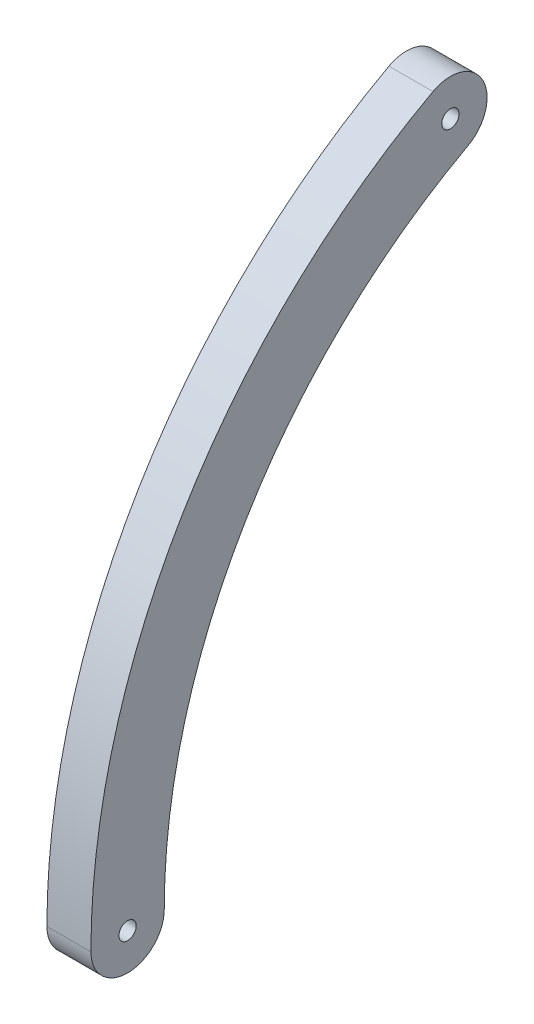
ISO-10303-21;
HEADER;
FILE_DESCRIPTION(('STEP AP214'),'2;1');
FILE_NAME('part.step','',(''),(''),'','','');
FILE_SCHEMA(('AUTOMOTIVE_DESIGN { 1 0 10303 214 1 1 1 1 }'));
ENDSEC;
DATA;
#1=APPLICATION_CONTEXT('core data for automotive mechanical design processes');
#2=APPLICATION_PROTOCOL_DEFINITION('international standard','automotive_design',2000,#1);
#3=PRODUCT_CONTEXT('',#1,'mechanical');
#4=PRODUCT('Part','Part','',(#3));
#5=PRODUCT_RELATED_PRODUCT_CATEGORY('part','',(#4));
#6=PRODUCT_DEFINITION_FORMATION('','',#4);
#7=PRODUCT_DEFINITION_CONTEXT('part definition',#1,'design');
#8=PRODUCT_DEFINITION('design','',#6,#7);
#9=PRODUCT_DEFINITION_SHAPE('','',#8);
#10=(LENGTH_UNIT() NAMED_UNIT(*) SI_UNIT(.MILLI.,.METRE.));
#11=(NAMED_UNIT(*) PLANE_ANGLE_UNIT() SI_UNIT($,.RADIAN.));
#12=(NAMED_UNIT(*) SI_UNIT($,.STERADIAN.) SOLID_ANGLE_UNIT());
#13=UNCERTAINTY_MEASURE_WITH_UNIT(LENGTH_MEASURE(1.E-05),#10,'distance_accuracy_value','');
#14=(GEOMETRIC_REPRESENTATION_CONTEXT(3) GLOBAL_UNCERTAINTY_ASSIGNED_CONTEXT((#13)) GLOBAL_UNIT_ASSIGNED_CONTEXT((#10,
#11,#12)) REPRESENTATION_CONTEXT('',''));
#15=CARTESIAN_POINT('',(0.,0.,0.));
#16=DIRECTION('',(0.,0.,1.));
#17=DIRECTION('',(1.,0.,0.));
#18=AXIS2_PLACEMENT_3D('',#15,#16,#17);
#19=CARTESIAN_POINT('',(3.81,0.,26.67));
#20=DIRECTION('',(1.,0.,0.));
#21=DIRECTION('',(0.,0.,-1.));
#22=AXIS2_PLACEMENT_3D('',#19,#20,#21);
#23=PLANE('',#22);
#24=CARTESIAN_POINT('',(3.81,46.9122949666017,25.3848809523809));
#25=DIRECTION('',(1.,0.,0.));
#26=DIRECTION('',(0.,0.,-1.));
#27=AXIS2_PLACEMENT_3D('',#24,#25,#26);
#28=CIRCLE('',#27,0.750000000000002);
#29=CARTESIAN_POINT('',(3.81,46.9122949666017,26.1348809523809));
#30=VERTEX_POINT('',#29);
#31=EDGE_CURVE('E101',#30,#30,#28,.T.);
#32=ORIENTED_EDGE('',*,*,#31,.F.);
#33=EDGE_LOOP('',(#32));
#34=FACE_BOUND('',#33,.T.);
#35=CARTESIAN_POINT('',(3.81,0.,53.34));
#36=DIRECTION('',(1.,0.,0.));
#37=DIRECTION('',(0.,0.,-1.));
#38=AXIS2_PLACEMENT_3D('',#35,#36,#37);
#39=CIRCLE('',#38,3.17499999999999);
#40=CARTESIAN_POINT('',(3.81,0.,56.515));
#41=VERTEX_POINT('',#40);
#42=CARTESIAN_POINT('',(3.81,0.,50.165));
#43=VERTEX_POINT('',#42);
#44=EDGE_CURVE('E86',#41,#43,#39,.T.);
#45=ORIENTED_EDGE('',*,*,#44,.T.);
#46=CARTESIAN_POINT('',(3.81,0.,0.));
#47=DIRECTION('',(-1.,0.,0.));
#48=DIRECTION('',(0.,0.,1.));
#49=AXIS2_PLACEMENT_3D('',#46,#47,#48);
#50=CIRCLE('',#49,50.165);
#51=CARTESIAN_POINT('',(3.81,44.119896456685,23.8738761337868));
#52=VERTEX_POINT('',#51);
#53=EDGE_CURVE('E81',#43,#52,#50,.T.);
#54=ORIENTED_EDGE('',*,*,#53,.T.);
#55=CARTESIAN_POINT('',(3.81,46.9122949666017,25.3848809523809));
#56=DIRECTION('',(1.,0.,0.));
#57=DIRECTION('',(0.,0.,-1.));
#58=AXIS2_PLACEMENT_3D('',#55,#56,#57);
#59=CIRCLE('',#58,3.175);
#60=CARTESIAN_POINT('',(3.81,49.7046934765185,26.895885770975));
#61=VERTEX_POINT('',#60);
#62=EDGE_CURVE('E84',#52,#61,#59,.T.);
#63=ORIENTED_EDGE('',*,*,#62,.T.);
#64=CARTESIAN_POINT('',(3.81,0.,0.));
#65=DIRECTION('',(1.,0.,0.));
#66=DIRECTION('',(0.,0.,1.));
#67=AXIS2_PLACEMENT_3D('',#64,#65,#66);
#68=CIRCLE('',#67,56.515);
#69=EDGE_CURVE('E51',#61,#41,#68,.T.);
#70=ORIENTED_EDGE('',*,*,#69,.T.);
#71=EDGE_LOOP('',(#45,#54,#63,#70));
#72=FACE_BOUND('',#71,.T.);
#73=CARTESIAN_POINT('',(3.81,0.,53.34));
#74=DIRECTION('',(1.,0.,0.));
#75=DIRECTION('',(0.,0.,-1.));
#76=AXIS2_PLACEMENT_3D('',#73,#74,#75);
#77=CIRCLE('',#76,0.749999999999999);
#78=CARTESIAN_POINT('',(3.81,0.,54.09));
#79=VERTEX_POINT('',#78);
#80=EDGE_CURVE('E116',#79,#79,#77,.T.);
#81=ORIENTED_EDGE('',*,*,#80,.F.);
#82=EDGE_LOOP('',(#81));
#83=FACE_BOUND('',#82,.T.);
#84=ADVANCED_FACE('F34',(#34,#72,#83),#23,.T.);
#85=CARTESIAN_POINT('',(0.,0.,26.67));
#86=DIRECTION('',(1.,0.,0.));
#87=DIRECTION('',(0.,0.,-1.));
#88=AXIS2_PLACEMENT_3D('',#85,#86,#87);
#89=PLANE('',#88);
#90=CARTESIAN_POINT('',(0.,0.,53.34));
#91=DIRECTION('',(1.,0.,0.));
#92=DIRECTION('',(0.,0.,-1.));
#93=AXIS2_PLACEMENT_3D('',#90,#91,#92);
#94=CIRCLE('',#93,3.17499999999999);
#95=CARTESIAN_POINT('',(0.,0.,56.515));
#96=VERTEX_POINT('',#95);
#97=CARTESIAN_POINT('',(0.,0.,50.165));
#98=VERTEX_POINT('',#97);
#99=EDGE_CURVE('E98',#96,#98,#94,.T.);
#100=ORIENTED_EDGE('',*,*,#99,.F.);
#101=CARTESIAN_POINT('',(0.,0.,0.));
#102=DIRECTION('',(1.,0.,0.));
#103=DIRECTION('',(0.,0.,1.));
#104=AXIS2_PLACEMENT_3D('',#101,#102,#103);
#105=CIRCLE('',#104,56.515);
#106=CARTESIAN_POINT('',(0.,49.7046934765185,26.895885770975));
#107=VERTEX_POINT('',#106);
#108=EDGE_CURVE('E74',#107,#96,#105,.T.);
#109=ORIENTED_EDGE('',*,*,#108,.F.);
#110=CARTESIAN_POINT('',(0.,46.9122949666017,25.3848809523809));
#111=DIRECTION('',(1.,0.,0.));
#112=DIRECTION('',(0.,0.,-1.));
#113=AXIS2_PLACEMENT_3D('',#110,#111,#112);
#114=CIRCLE('',#113,3.175);
#115=CARTESIAN_POINT('',(0.,44.119896456685,23.8738761337868));
#116=VERTEX_POINT('',#115);
#117=EDGE_CURVE('E68',#116,#107,#114,.T.);
#118=ORIENTED_EDGE('',*,*,#117,.F.);
#119=CARTESIAN_POINT('',(0.,0.,0.));
#120=DIRECTION('',(-1.,0.,0.));
#121=DIRECTION('',(0.,0.,1.));
#122=AXIS2_PLACEMENT_3D('',#119,#120,#121);
#123=CIRCLE('',#122,50.165);
#124=EDGE_CURVE('E90',#98,#116,#123,.T.);
#125=ORIENTED_EDGE('',*,*,#124,.F.);
#126=EDGE_LOOP('',(#100,#109,#118,#125));
#127=FACE_BOUND('',#126,.T.);
#128=CARTESIAN_POINT('',(0.,46.9122949666017,25.3848809523809));
#129=DIRECTION('',(1.,0.,0.));
#130=DIRECTION('',(0.,0.,-1.));
#131=AXIS2_PLACEMENT_3D('',#128,#129,#130);
#132=CIRCLE('',#131,0.750000000000002);
#133=CARTESIAN_POINT('',(0.,46.9122949666017,26.1348809523809));
#134=VERTEX_POINT('',#133);
#135=EDGE_CURVE('E113',#134,#134,#132,.T.);
#136=ORIENTED_EDGE('',*,*,#135,.T.);
#137=EDGE_LOOP('',(#136));
#138=FACE_BOUND('',#137,.T.);
#139=CARTESIAN_POINT('',(0.,0.,53.34));
#140=DIRECTION('',(1.,0.,0.));
#141=DIRECTION('',(0.,0.,-1.));
#142=AXIS2_PLACEMENT_3D('',#139,#140,#141);
#143=CIRCLE('',#142,0.749999999999999);
#144=CARTESIAN_POINT('',(0.,0.,54.09));
#145=VERTEX_POINT('',#144);
#146=EDGE_CURVE('E119',#145,#145,#143,.T.);
#147=ORIENTED_EDGE('',*,*,#146,.T.);
#148=EDGE_LOOP('',(#147));
#149=FACE_BOUND('',#148,.T.);
#150=ADVANCED_FACE('F109',(#127,#138,#149),#89,.F.);
#151=CARTESIAN_POINT('',(3.81,0.,53.34));
#152=DIRECTION('',(-1.,0.,0.));
#153=DIRECTION('',(0.,0.,1.));
#154=AXIS2_PLACEMENT_3D('',#151,#152,#153);
#155=CYLINDRICAL_SURFACE('',#154,3.17499999999999);
#156=ORIENTED_EDGE('',*,*,#99,.T.);
#157=DIRECTION('',(-1.,0.,0.));
#158=VECTOR('',#157,1.);
#159=CARTESIAN_POINT('',(3.81,0.,50.165));
#160=LINE('',#159,#158);
#161=EDGE_CURVE('E11',#43,#98,#160,.T.);
#162=ORIENTED_EDGE('',*,*,#161,.F.);
#163=ORIENTED_EDGE('',*,*,#44,.F.);
#164=DIRECTION('',(-1.,0.,0.));
#165=VECTOR('',#164,1.);
#166=CARTESIAN_POINT('',(3.81,0.,56.515));
#167=LINE('',#166,#165);
#168=EDGE_CURVE('E94',#41,#96,#167,.T.);
#169=ORIENTED_EDGE('',*,*,#168,.T.);
#170=EDGE_LOOP('',(#156,#162,#163,#169));
#171=FACE_BOUND('',#170,.T.);
#172=ADVANCED_FACE('F36',(#171),#155,.T.);
#173=CARTESIAN_POINT('',(3.81,0.,0.));
#174=DIRECTION('',(-1.,0.,0.));
#175=DIRECTION('',(0.,0.,1.));
#176=AXIS2_PLACEMENT_3D('',#173,#174,#175);
#177=CYLINDRICAL_SURFACE('',#176,50.165);
#178=ORIENTED_EDGE('',*,*,#124,.T.);
#179=DIRECTION('',(-1.,0.,0.));
#180=VECTOR('',#179,1.);
#181=CARTESIAN_POINT('',(3.81,44.119896456685,23.8738761337868));
#182=LINE('',#181,#180);
#183=EDGE_CURVE('E43',#52,#116,#182,.T.);
#184=ORIENTED_EDGE('',*,*,#183,.F.);
#185=ORIENTED_EDGE('',*,*,#53,.F.);
#186=ORIENTED_EDGE('',*,*,#161,.T.);
#187=EDGE_LOOP('',(#178,#184,#185,#186));
#188=FACE_BOUND('',#187,.T.);
#189=ADVANCED_FACE('F89',(#188),#177,.F.);
#190=CARTESIAN_POINT('',(3.81,46.9122949666017,25.3848809523809));
#191=DIRECTION('',(-1.,0.,0.));
#192=DIRECTION('',(0.,0.,1.));
#193=AXIS2_PLACEMENT_3D('',#190,#191,#192);
#194=CYLINDRICAL_SURFACE('',#193,3.175);
#195=ORIENTED_EDGE('',*,*,#117,.T.);
#196=DIRECTION('',(-1.,0.,0.));
#197=VECTOR('',#196,1.);
#198=CARTESIAN_POINT('',(3.81,49.7046934765185,26.895885770975));
#199=LINE('',#198,#197);
#200=EDGE_CURVE('E91',#61,#107,#199,.T.);
#201=ORIENTED_EDGE('',*,*,#200,.F.);
#202=ORIENTED_EDGE('',*,*,#62,.F.);
#203=ORIENTED_EDGE('',*,*,#183,.T.);
#204=EDGE_LOOP('',(#195,#201,#202,#203));
#205=FACE_BOUND('',#204,.T.);
#206=ADVANCED_FACE('F92',(#205),#194,.T.);
#207=CARTESIAN_POINT('',(3.81,0.,0.));
#208=DIRECTION('',(-1.,0.,0.));
#209=DIRECTION('',(0.,0.,1.));
#210=AXIS2_PLACEMENT_3D('',#207,#208,#209);
#211=CYLINDRICAL_SURFACE('',#210,56.515);
#212=ORIENTED_EDGE('',*,*,#108,.T.);
#213=ORIENTED_EDGE('',*,*,#168,.F.);
#214=ORIENTED_EDGE('',*,*,#69,.F.);
#215=ORIENTED_EDGE('',*,*,#200,.T.);
#216=EDGE_LOOP('',(#212,#213,#214,#215));
#217=FACE_BOUND('',#216,.T.);
#218=ADVANCED_FACE('F106',(#217),#211,.T.);
#219=CARTESIAN_POINT('',(3.81,46.9122949666017,25.3848809523809));
#220=DIRECTION('',(-1.,0.,0.));
#221=DIRECTION('',(0.,0.,1.));
#222=AXIS2_PLACEMENT_3D('',#219,#220,#221);
#223=CYLINDRICAL_SURFACE('',#222,0.750000000000002);
#224=CARTESIAN_POINT('',(3.81,46.9122949666017,26.1348809523809));
#225=CARTESIAN_POINT('',(3.7703125,46.9122949666017,26.1348809523809));
#226=CARTESIAN_POINT('',(3.730625,46.9122949666017,26.1348809523809));
#227=CARTESIAN_POINT('',(3.65125,46.9122949666017,26.1348809523809));
#228=CARTESIAN_POINT('',(3.6115625,46.9122949666017,26.1348809523809));
#229=CARTESIAN_POINT('',(3.5321875,46.9122949666017,26.1348809523809));
#230=CARTESIAN_POINT('',(3.4925,46.9122949666017,26.1348809523809));
#231=CARTESIAN_POINT('',(3.413125,46.9122949666017,26.1348809523809));
#232=CARTESIAN_POINT('',(3.3734375,46.9122949666017,26.1348809523809));
#233=CARTESIAN_POINT('',(3.2940625,46.9122949666017,26.1348809523809));
#234=CARTESIAN_POINT('',(3.254375,46.9122949666017,26.1348809523809));
#235=CARTESIAN_POINT('',(3.175,46.9122949666017,26.1348809523809));
#236=CARTESIAN_POINT('',(3.1353125,46.9122949666017,26.1348809523809));
#237=CARTESIAN_POINT('',(3.0559375,46.9122949666017,26.1348809523809));
#238=CARTESIAN_POINT('',(3.01625,46.9122949666017,26.1348809523809));
#239=CARTESIAN_POINT('',(2.936875,46.9122949666017,26.1348809523809));
#240=CARTESIAN_POINT('',(2.8971875,46.9122949666017,26.1348809523809));
#241=CARTESIAN_POINT('',(2.8178125,46.9122949666017,26.1348809523809));
#242=CARTESIAN_POINT('',(2.778125,46.9122949666017,26.1348809523809));
#243=CARTESIAN_POINT('',(2.69875,46.9122949666017,26.1348809523809));
#244=CARTESIAN_POINT('',(2.6590625,46.9122949666017,26.1348809523809));
#245=CARTESIAN_POINT('',(2.5796875,46.9122949666017,26.1348809523809));
#246=CARTESIAN_POINT('',(2.54,46.9122949666017,26.1348809523809));
#247=CARTESIAN_POINT('',(2.460625,46.9122949666017,26.1348809523809));
#248=CARTESIAN_POINT('',(2.4209375,46.9122949666017,26.1348809523809));
#249=CARTESIAN_POINT('',(2.3415625,46.9122949666017,26.1348809523809));
#250=CARTESIAN_POINT('',(2.301875,46.9122949666017,26.1348809523809));
#251=CARTESIAN_POINT('',(2.2225,46.9122949666017,26.1348809523809));
#252=CARTESIAN_POINT('',(2.1828125,46.9122949666017,26.1348809523809));
#253=CARTESIAN_POINT('',(2.1034375,46.9122949666017,26.1348809523809));
#254=CARTESIAN_POINT('',(2.06375,46.9122949666017,26.1348809523809));
#255=CARTESIAN_POINT('',(1.984375,46.9122949666017,26.1348809523809));
#256=CARTESIAN_POINT('',(1.9446875,46.9122949666017,26.1348809523809));
#257=CARTESIAN_POINT('',(1.8653125,46.9122949666017,26.1348809523809));
#258=CARTESIAN_POINT('',(1.825625,46.9122949666017,26.1348809523809));
#259=CARTESIAN_POINT('',(1.74625,46.9122949666017,26.1348809523809));
#260=CARTESIAN_POINT('',(1.7065625,46.9122949666017,26.1348809523809));
#261=CARTESIAN_POINT('',(1.6271875,46.9122949666017,26.1348809523809));
#262=CARTESIAN_POINT('',(1.5875,46.9122949666017,26.1348809523809));
#263=CARTESIAN_POINT('',(1.508125,46.9122949666017,26.1348809523809));
#264=CARTESIAN_POINT('',(1.4684375,46.9122949666017,26.1348809523809));
#265=CARTESIAN_POINT('',(1.3890625,46.9122949666017,26.1348809523809));
#266=CARTESIAN_POINT('',(1.349375,46.9122949666017,26.1348809523809));
#267=CARTESIAN_POINT('',(1.27,46.9122949666017,26.1348809523809));
#268=CARTESIAN_POINT('',(1.2303125,46.9122949666017,26.1348809523809));
#269=CARTESIAN_POINT('',(1.1509375,46.9122949666017,26.1348809523809));
#270=CARTESIAN_POINT('',(1.11125,46.9122949666017,26.1348809523809));
#271=CARTESIAN_POINT('',(1.031875,46.9122949666017,26.1348809523809));
#272=CARTESIAN_POINT('',(0.9921875,46.9122949666017,26.1348809523809));
#273=CARTESIAN_POINT('',(0.9128125,46.9122949666017,26.1348809523809));
#274=CARTESIAN_POINT('',(0.873125,46.9122949666017,26.1348809523809));
#275=CARTESIAN_POINT('',(0.79375,46.9122949666017,26.1348809523809));
#276=CARTESIAN_POINT('',(0.7540625,46.9122949666017,26.1348809523809));
#277=CARTESIAN_POINT('',(0.6746875,46.9122949666017,26.1348809523809));
#278=CARTESIAN_POINT('',(0.635,46.9122949666017,26.1348809523809));
#279=CARTESIAN_POINT('',(0.555625,46.9122949666017,26.1348809523809));
#280=CARTESIAN_POINT('',(0.5159375,46.9122949666017,26.1348809523809));
#281=CARTESIAN_POINT('',(0.4365625,46.9122949666017,26.1348809523809));
#282=CARTESIAN_POINT('',(0.396875,46.9122949666017,26.1348809523809));
#283=CARTESIAN_POINT('',(0.3175,46.9122949666017,26.1348809523809));
#284=CARTESIAN_POINT('',(0.2778125,46.9122949666017,26.1348809523809));
#285=CARTESIAN_POINT('',(0.1984375,46.9122949666017,26.1348809523809));
#286=CARTESIAN_POINT('',(0.15875,46.9122949666017,26.1348809523809));
#287=CARTESIAN_POINT('',(0.0793749999999999,46.9122949666017,26.1348809523809));
#288=CARTESIAN_POINT('',(0.0396874999999999,46.9122949666017,26.1348809523809));
#289=CARTESIAN_POINT('',(0.,46.9122949666017,26.1348809523809));
#290=B_SPLINE_CURVE_WITH_KNOTS('',3,(#224,#225,#226,#227,#228,#229,#230,#231,#232,#233,#234,
#235,#236,#237,#238,#239,#240,#241,#242,#243,#244,#245,#246,#247,#248,#249,#250,#251,#252,#253,
#254,#255,#256,#257,#258,#259,#260,#261,#262,#263,#264,#265,#266,#267,#268,#269,#270,#271,#272,
#273,#274,#275,#276,#277,#278,#279,#280,#281,#282,#283,#284,#285,#286,#287,#288,#289),
.UNSPECIFIED.,.F.,.F.,(4,2,2,2,2,2,2,2,2,2,2,2,2,2,2,2,2,2,2,2,2,2,2,2,2,2,2,2,2,2,2,2,4),(0.,
0.1190625,0.238125,0.3571875,0.47625,0.595312499999999,0.714375,0.833437499999999,
0.952499999999999,1.0715625,1.190625,1.3096875,1.42875,1.5478125,1.666875,1.7859375,1.905,
2.0240625,2.143125,2.2621875,2.38125,2.5003125,2.619375,2.7384375,2.8575,2.9765625,3.095625,
3.2146875,3.33375,3.4528125,3.571875,3.6909375,3.81),.UNSPECIFIED.);
#291=EDGE_CURVE('BSEAM136',#30,#134,#290,.T.);
#292=ORIENTED_EDGE('',*,*,#31,.T.);
#293=ORIENTED_EDGE('',*,*,#135,.F.);
#294=ORIENTED_EDGE('',*,*,#291,.T.);
#295=ORIENTED_EDGE('',*,*,#291,.F.);
#296=EDGE_LOOP('',(#292,#294,#293,#295));
#297=FACE_BOUND('',#296,.T.);
#298=ADVANCED_FACE('F136',(#297),#223,.F.);
#299=CARTESIAN_POINT('',(3.81,0.,53.34));
#300=DIRECTION('',(-1.,0.,0.));
#301=DIRECTION('',(0.,0.,1.));
#302=AXIS2_PLACEMENT_3D('',#299,#300,#301);
#303=CYLINDRICAL_SURFACE('',#302,0.749999999999999);
#304=CARTESIAN_POINT('',(3.81,0.,54.09));
#305=CARTESIAN_POINT('',(3.7703125,0.,54.09));
#306=CARTESIAN_POINT('',(3.730625,0.,54.09));
#307=CARTESIAN_POINT('',(3.65125,0.,54.09));
#308=CARTESIAN_POINT('',(3.6115625,0.,54.09));
#309=CARTESIAN_POINT('',(3.5321875,0.,54.09));
#310=CARTESIAN_POINT('',(3.4925,0.,54.09));
#311=CARTESIAN_POINT('',(3.413125,0.,54.09));
#312=CARTESIAN_POINT('',(3.3734375,0.,54.09));
#313=CARTESIAN_POINT('',(3.2940625,0.,54.09));
#314=CARTESIAN_POINT('',(3.254375,0.,54.09));
#315=CARTESIAN_POINT('',(3.175,0.,54.09));
#316=CARTESIAN_POINT('',(3.1353125,0.,54.09));
#317=CARTESIAN_POINT('',(3.0559375,0.,54.09));
#318=CARTESIAN_POINT('',(3.01625,0.,54.09));
#319=CARTESIAN_POINT('',(2.936875,0.,54.09));
#320=CARTESIAN_POINT('',(2.8971875,0.,54.09));
#321=CARTESIAN_POINT('',(2.8178125,0.,54.09));
#322=CARTESIAN_POINT('',(2.778125,0.,54.09));
#323=CARTESIAN_POINT('',(2.69875,0.,54.09));
#324=CARTESIAN_POINT('',(2.6590625,0.,54.09));
#325=CARTESIAN_POINT('',(2.5796875,0.,54.09));
#326=CARTESIAN_POINT('',(2.54,0.,54.09));
#327=CARTESIAN_POINT('',(2.460625,0.,54.09));
#328=CARTESIAN_POINT('',(2.4209375,0.,54.09));
#329=CARTESIAN_POINT('',(2.3415625,0.,54.09));
#330=CARTESIAN_POINT('',(2.301875,0.,54.09));
#331=CARTESIAN_POINT('',(2.2225,0.,54.09));
#332=CARTESIAN_POINT('',(2.1828125,0.,54.09));
#333=CARTESIAN_POINT('',(2.1034375,0.,54.09));
#334=CARTESIAN_POINT('',(2.06375,0.,54.09));
#335=CARTESIAN_POINT('',(1.984375,0.,54.09));
#336=CARTESIAN_POINT('',(1.9446875,0.,54.09));
#337=CARTESIAN_POINT('',(1.8653125,0.,54.09));
#338=CARTESIAN_POINT('',(1.825625,0.,54.09));
#339=CARTESIAN_POINT('',(1.74625,0.,54.09));
#340=CARTESIAN_POINT('',(1.7065625,0.,54.09));
#341=CARTESIAN_POINT('',(1.6271875,0.,54.09));
#342=CARTESIAN_POINT('',(1.5875,0.,54.09));
#343=CARTESIAN_POINT('',(1.508125,0.,54.09));
#344=CARTESIAN_POINT('',(1.4684375,0.,54.09));
#345=CARTESIAN_POINT('',(1.3890625,0.,54.09));
#346=CARTESIAN_POINT('',(1.349375,0.,54.09));
#347=CARTESIAN_POINT('',(1.27,0.,54.09));
#348=CARTESIAN_POINT('',(1.2303125,0.,54.09));
#349=CARTESIAN_POINT('',(1.1509375,0.,54.09));
#350=CARTESIAN_POINT('',(1.11125,0.,54.09));
#351=CARTESIAN_POINT('',(1.031875,0.,54.09));
#352=CARTESIAN_POINT('',(0.9921875,0.,54.09));
#353=CARTESIAN_POINT('',(0.9128125,0.,54.09));
#354=CARTESIAN_POINT('',(0.873125,0.,54.09));
#355=CARTESIAN_POINT('',(0.79375,0.,54.09));
#356=CARTESIAN_POINT('',(0.7540625,0.,54.09));
#357=CARTESIAN_POINT('',(0.6746875,0.,54.09));
#358=CARTESIAN_POINT('',(0.635,0.,54.09));
#359=CARTESIAN_POINT('',(0.555625,0.,54.09));
#360=CARTESIAN_POINT('',(0.5159375,0.,54.09));
#361=CARTESIAN_POINT('',(0.4365625,0.,54.09));
#362=CARTESIAN_POINT('',(0.396875,0.,54.09));
#363=CARTESIAN_POINT('',(0.3175,0.,54.09));
#364=CARTESIAN_POINT('',(0.2778125,0.,54.09));
#365=CARTESIAN_POINT('',(0.1984375,0.,54.09));
#366=CARTESIAN_POINT('',(0.15875,0.,54.09));
#367=CARTESIAN_POINT('',(0.0793749999999999,0.,54.09));
#368=CARTESIAN_POINT('',(0.0396874999999999,0.,54.09));
#369=CARTESIAN_POINT('',(0.,0.,54.09));
#370=B_SPLINE_CURVE_WITH_KNOTS('',3,(#304,#305,#306,#307,#308,#309,#310,#311,#312,#313,#314,
#315,#316,#317,#318,#319,#320,#321,#322,#323,#324,#325,#326,#327,#328,#329,#330,#331,#332,#333,
#334,#335,#336,#337,#338,#339,#340,#341,#342,#343,#344,#345,#346,#347,#348,#349,#350,#351,#352,
#353,#354,#355,#356,#357,#358,#359,#360,#361,#362,#363,#364,#365,#366,#367,#368,#369),
.UNSPECIFIED.,.F.,.F.,(4,2,2,2,2,2,2,2,2,2,2,2,2,2,2,2,2,2,2,2,2,2,2,2,2,2,2,2,2,2,2,2,4),(0.,
0.1190625,0.238125,0.3571875,0.47625,0.595312499999999,0.714375,0.833437499999999,
0.952499999999999,1.0715625,1.190625,1.3096875,1.42875,1.5478125,1.666875,1.7859375,1.905,
2.0240625,2.143125,2.2621875,2.38125,2.5003125,2.619375,2.7384375,2.8575,2.9765625,3.095625,
3.2146875,3.33375,3.4528125,3.571875,3.6909375,3.81),.UNSPECIFIED.);
#371=EDGE_CURVE('BSEAM125',#79,#145,#370,.T.);
#372=ORIENTED_EDGE('',*,*,#80,.T.);
#373=ORIENTED_EDGE('',*,*,#146,.F.);
#374=ORIENTED_EDGE('',*,*,#371,.T.);
#375=ORIENTED_EDGE('',*,*,#371,.F.);
#376=EDGE_LOOP('',(#372,#374,#373,#375));
#377=FACE_BOUND('',#376,.T.);
#378=ADVANCED_FACE('F125',(#377),#303,.F.);
#379=CLOSED_SHELL('',(#84,#150,#172,#189,#206,#218,#298,#378));
#380=MANIFOLD_SOLID_BREP('B2',#379);
#381=ADVANCED_BREP_SHAPE_REPRESENTATION('',(#18,#380),#14);
#382=SHAPE_DEFINITION_REPRESENTATION(#9,#381);
ENDSEC;
END-ISO-10303-21;
